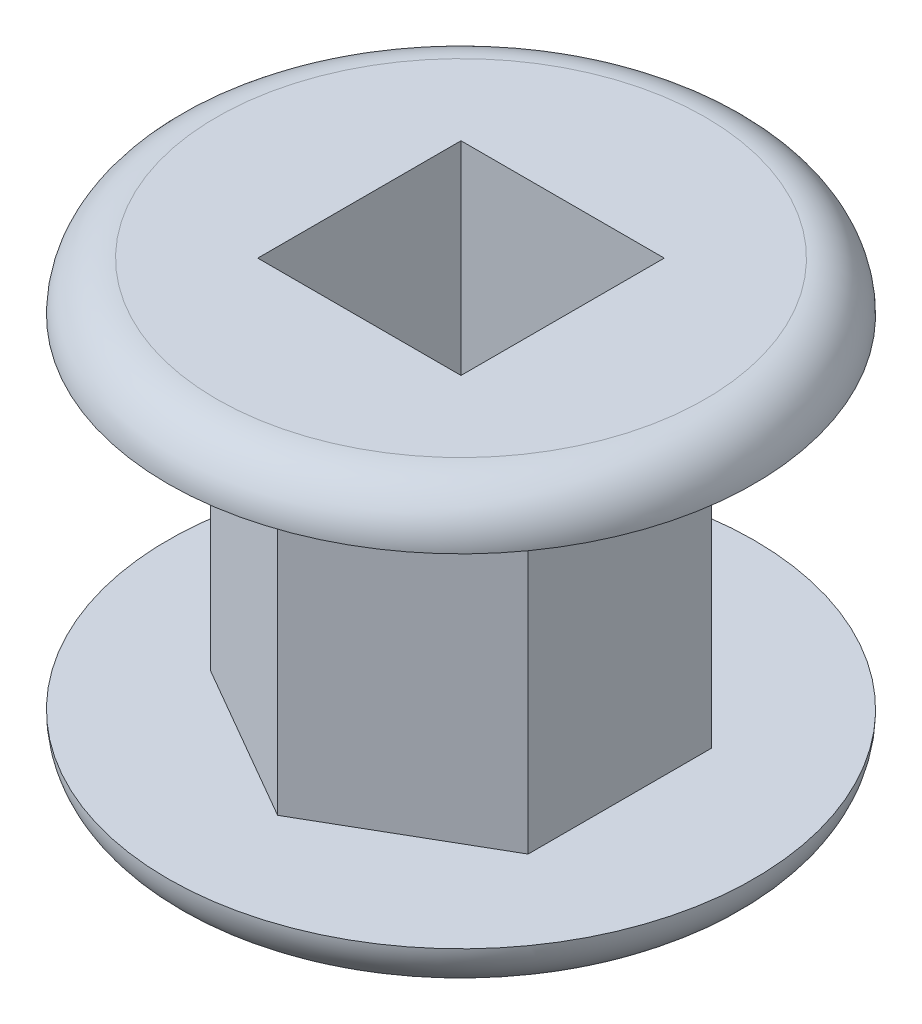
ISO-10303-21;
HEADER;
FILE_DESCRIPTION(('STEP AP214'),'2;1');
FILE_NAME('part.step','',(''),(''),'','','');
FILE_SCHEMA(('AUTOMOTIVE_DESIGN { 1 0 10303 214 1 1 1 1 }'));
ENDSEC;
DATA;
#1=APPLICATION_CONTEXT('core data for automotive mechanical design processes');
#2=APPLICATION_PROTOCOL_DEFINITION('international standard','automotive_design',2000,#1);
#3=PRODUCT_CONTEXT('',#1,'mechanical');
#4=PRODUCT('Part','Part','',(#3));
#5=PRODUCT_RELATED_PRODUCT_CATEGORY('part','',(#4));
#6=PRODUCT_DEFINITION_FORMATION('','',#4);
#7=PRODUCT_DEFINITION_CONTEXT('part definition',#1,'design');
#8=PRODUCT_DEFINITION('design','',#6,#7);
#9=PRODUCT_DEFINITION_SHAPE('','',#8);
#10=(LENGTH_UNIT() NAMED_UNIT(*) SI_UNIT(.MILLI.,.METRE.));
#11=(NAMED_UNIT(*) PLANE_ANGLE_UNIT() SI_UNIT($,.RADIAN.));
#12=(NAMED_UNIT(*) SI_UNIT($,.STERADIAN.) SOLID_ANGLE_UNIT());
#13=UNCERTAINTY_MEASURE_WITH_UNIT(LENGTH_MEASURE(1.E-05),#10,'distance_accuracy_value','');
#14=(GEOMETRIC_REPRESENTATION_CONTEXT(3) GLOBAL_UNCERTAINTY_ASSIGNED_CONTEXT((#13)) GLOBAL_UNIT_ASSIGNED_CONTEXT((#10,
#11,#12)) REPRESENTATION_CONTEXT('',''));
#15=CARTESIAN_POINT('',(0.,0.,0.));
#16=DIRECTION('',(0.,0.,1.));
#17=DIRECTION('',(1.,0.,0.));
#18=AXIS2_PLACEMENT_3D('',#15,#16,#17);
#19=CARTESIAN_POINT('',(5.159375,6.35,-2.97876654510023));
#20=DIRECTION('',(-0.5,0.,0.866025403784439));
#21=DIRECTION('',(0.866025403784439,0.,0.5));
#22=AXIS2_PLACEMENT_3D('',#19,#20,#21);
#23=PLANE('',#22);
#24=DIRECTION('',(0.866025403784439,0.,0.5));
#25=VECTOR('',#24,1.);
#26=CARTESIAN_POINT('',(5.159375,-5.55625,-2.97876654510023));
#27=LINE('',#26,#25);
#28=CARTESIAN_POINT('',(0.,-5.55625,-5.95753309020045));
#29=VERTEX_POINT('',#28);
#30=CARTESIAN_POINT('',(5.159375,-5.55625,-2.97876654510023));
#31=VERTEX_POINT('',#30);
#32=EDGE_CURVE('E166',#29,#31,#27,.T.);
#33=ORIENTED_EDGE('',*,*,#32,.F.);
#34=DIRECTION('',(0.,-1.,0.));
#35=VECTOR('',#34,1.);
#36=CARTESIAN_POINT('',(0.,6.35,-5.95753309020045));
#37=LINE('',#36,#35);
#38=CARTESIAN_POINT('',(0.,5.55625,-5.95753309020045));
#39=VERTEX_POINT('',#38);
#40=EDGE_CURVE('E201',#39,#29,#37,.T.);
#41=ORIENTED_EDGE('',*,*,#40,.F.);
#42=DIRECTION('',(-0.866025403784439,0.,-0.5));
#43=VECTOR('',#42,1.);
#44=CARTESIAN_POINT('',(5.159375,5.55625,-2.97876654510023));
#45=LINE('',#44,#43);
#46=CARTESIAN_POINT('',(5.159375,5.55625,-2.97876654510023));
#47=VERTEX_POINT('',#46);
#48=EDGE_CURVE('E184',#47,#39,#45,.T.);
#49=ORIENTED_EDGE('',*,*,#48,.F.);
#50=DIRECTION('',(0.,-1.,0.));
#51=VECTOR('',#50,1.);
#52=CARTESIAN_POINT('',(5.159375,6.35,-2.97876654510023));
#53=LINE('',#52,#51);
#54=EDGE_CURVE('E187',#47,#31,#53,.T.);
#55=ORIENTED_EDGE('',*,*,#54,.T.);
#56=EDGE_LOOP('',(#33,#41,#49,#55));
#57=FACE_BOUND('',#56,.T.);
#58=ADVANCED_FACE('F39',(#57),#23,.F.);
#59=CARTESIAN_POINT('',(0.,6.35,-5.95753309020045));
#60=DIRECTION('',(0.5,0.,0.866025403784439));
#61=DIRECTION('',(0.866025403784439,0.,-0.5));
#62=AXIS2_PLACEMENT_3D('',#59,#60,#61);
#63=PLANE('',#62);
#64=DIRECTION('',(0.866025403784439,0.,-0.5));
#65=VECTOR('',#64,1.);
#66=CARTESIAN_POINT('',(0.,-5.55625,-5.95753309020045));
#67=LINE('',#66,#65);
#68=CARTESIAN_POINT('',(-5.159375,-5.55625,-2.97876654510023));
#69=VERTEX_POINT('',#68);
#70=EDGE_CURVE('E163',#69,#29,#67,.T.);
#71=ORIENTED_EDGE('',*,*,#70,.F.);
#72=DIRECTION('',(0.,-1.,0.));
#73=VECTOR('',#72,1.);
#74=CARTESIAN_POINT('',(-5.159375,6.35,-2.97876654510023));
#75=LINE('',#74,#73);
#76=CARTESIAN_POINT('',(-5.159375,5.55625,-2.97876654510023));
#77=VERTEX_POINT('',#76);
#78=EDGE_CURVE('E198',#77,#69,#75,.T.);
#79=ORIENTED_EDGE('',*,*,#78,.F.);
#80=DIRECTION('',(-0.866025403784439,0.,0.5));
#81=VECTOR('',#80,1.);
#82=CARTESIAN_POINT('',(0.,5.55625,-5.95753309020045));
#83=LINE('',#82,#81);
#84=EDGE_CURVE('E181',#39,#77,#83,.T.);
#85=ORIENTED_EDGE('',*,*,#84,.F.);
#86=ORIENTED_EDGE('',*,*,#40,.T.);
#87=EDGE_LOOP('',(#71,#79,#85,#86));
#88=FACE_BOUND('',#87,.T.);
#89=ADVANCED_FACE('F225',(#88),#63,.F.);
#90=CARTESIAN_POINT('',(-5.159375,6.35,-2.97876654510023));
#91=DIRECTION('',(1.,0.,0.));
#92=DIRECTION('',(0.,0.,-1.));
#93=AXIS2_PLACEMENT_3D('',#90,#91,#92);
#94=PLANE('',#93);
#95=DIRECTION('',(0.,0.,-1.));
#96=VECTOR('',#95,1.);
#97=CARTESIAN_POINT('',(-5.159375,-5.55625,-2.97876654510023));
#98=LINE('',#97,#96);
#99=CARTESIAN_POINT('',(-5.159375,-5.55625,2.97876654510023));
#100=VERTEX_POINT('',#99);
#101=EDGE_CURVE('E160',#100,#69,#98,.T.);
#102=ORIENTED_EDGE('',*,*,#101,.F.);
#103=DIRECTION('',(0.,-1.,0.));
#104=VECTOR('',#103,1.);
#105=CARTESIAN_POINT('',(-5.159375,6.35,2.97876654510023));
#106=LINE('',#105,#104);
#107=CARTESIAN_POINT('',(-5.159375,5.55625,2.97876654510023));
#108=VERTEX_POINT('',#107);
#109=EDGE_CURVE('E195',#108,#100,#106,.T.);
#110=ORIENTED_EDGE('',*,*,#109,.F.);
#111=DIRECTION('',(0.,0.,1.));
#112=VECTOR('',#111,1.);
#113=CARTESIAN_POINT('',(-5.159375,5.55625,-2.97876654510023));
#114=LINE('',#113,#112);
#115=EDGE_CURVE('E178',#77,#108,#114,.T.);
#116=ORIENTED_EDGE('',*,*,#115,.F.);
#117=ORIENTED_EDGE('',*,*,#78,.T.);
#118=EDGE_LOOP('',(#102,#110,#116,#117));
#119=FACE_BOUND('',#118,.T.);
#120=ADVANCED_FACE('F228',(#119),#94,.F.);
#121=CARTESIAN_POINT('',(-5.159375,6.35,2.97876654510023));
#122=DIRECTION('',(0.5,0.,-0.866025403784439));
#123=DIRECTION('',(-0.866025403784439,0.,-0.5));
#124=AXIS2_PLACEMENT_3D('',#121,#122,#123);
#125=PLANE('',#124);
#126=DIRECTION('',(-0.866025403784439,0.,-0.5));
#127=VECTOR('',#126,1.);
#128=CARTESIAN_POINT('',(-5.159375,-5.55625,2.97876654510023));
#129=LINE('',#128,#127);
#130=CARTESIAN_POINT('',(0.,-5.55625,5.95753309020045));
#131=VERTEX_POINT('',#130);
#132=EDGE_CURVE('E157',#131,#100,#129,.T.);
#133=ORIENTED_EDGE('',*,*,#132,.F.);
#134=DIRECTION('',(0.,-1.,0.));
#135=VECTOR('',#134,1.);
#136=CARTESIAN_POINT('',(0.,6.35,5.95753309020045));
#137=LINE('',#136,#135);
#138=CARTESIAN_POINT('',(0.,5.55625,5.95753309020045));
#139=VERTEX_POINT('',#138);
#140=EDGE_CURVE('E192',#139,#131,#137,.T.);
#141=ORIENTED_EDGE('',*,*,#140,.F.);
#142=DIRECTION('',(0.866025403784439,0.,0.5));
#143=VECTOR('',#142,1.);
#144=CARTESIAN_POINT('',(-5.159375,5.55625,2.97876654510023));
#145=LINE('',#144,#143);
#146=EDGE_CURVE('E175',#108,#139,#145,.T.);
#147=ORIENTED_EDGE('',*,*,#146,.F.);
#148=ORIENTED_EDGE('',*,*,#109,.T.);
#149=EDGE_LOOP('',(#133,#141,#147,#148));
#150=FACE_BOUND('',#149,.T.);
#151=ADVANCED_FACE('F242',(#150),#125,.F.);
#152=CARTESIAN_POINT('',(0.,6.35,5.95753309020045));
#153=DIRECTION('',(-0.5,0.,-0.866025403784439));
#154=DIRECTION('',(-0.866025403784439,0.,0.5));
#155=AXIS2_PLACEMENT_3D('',#152,#153,#154);
#156=PLANE('',#155);
#157=DIRECTION('',(-0.866025403784439,0.,0.5));
#158=VECTOR('',#157,1.);
#159=CARTESIAN_POINT('',(0.,-5.55625,5.95753309020045));
#160=LINE('',#159,#158);
#161=CARTESIAN_POINT('',(5.159375,-5.55625,2.97876654510023));
#162=VERTEX_POINT('',#161);
#163=EDGE_CURVE('E154',#162,#131,#160,.T.);
#164=ORIENTED_EDGE('',*,*,#163,.F.);
#165=DIRECTION('',(0.,-1.,0.));
#166=VECTOR('',#165,1.);
#167=CARTESIAN_POINT('',(5.159375,6.35,2.97876654510023));
#168=LINE('',#167,#166);
#169=CARTESIAN_POINT('',(5.159375,5.55625,2.97876654510023));
#170=VERTEX_POINT('',#169);
#171=EDGE_CURVE('E190',#170,#162,#168,.T.);
#172=ORIENTED_EDGE('',*,*,#171,.F.);
#173=DIRECTION('',(0.866025403784439,0.,-0.5));
#174=VECTOR('',#173,1.);
#175=CARTESIAN_POINT('',(0.,5.55625,5.95753309020045));
#176=LINE('',#175,#174);
#177=EDGE_CURVE('E172',#139,#170,#176,.T.);
#178=ORIENTED_EDGE('',*,*,#177,.F.);
#179=ORIENTED_EDGE('',*,*,#140,.T.);
#180=EDGE_LOOP('',(#164,#172,#178,#179));
#181=FACE_BOUND('',#180,.T.);
#182=ADVANCED_FACE('F239',(#181),#156,.F.);
#183=CARTESIAN_POINT('',(5.159375,6.35,2.97876654510023));
#184=DIRECTION('',(-1.,0.,0.));
#185=DIRECTION('',(0.,0.,1.));
#186=AXIS2_PLACEMENT_3D('',#183,#184,#185);
#187=PLANE('',#186);
#188=DIRECTION('',(0.,0.,1.));
#189=VECTOR('',#188,1.);
#190=CARTESIAN_POINT('',(5.159375,-5.55625,2.97876654510023));
#191=LINE('',#190,#189);
#192=EDGE_CURVE('E207',#31,#162,#191,.T.);
#193=ORIENTED_EDGE('',*,*,#192,.F.);
#194=ORIENTED_EDGE('',*,*,#54,.F.);
#195=DIRECTION('',(0.,0.,-1.));
#196=VECTOR('',#195,1.);
#197=CARTESIAN_POINT('',(5.159375,5.55625,2.97876654510023));
#198=LINE('',#197,#196);
#199=EDGE_CURVE('E204',#170,#47,#198,.T.);
#200=ORIENTED_EDGE('',*,*,#199,.F.);
#201=ORIENTED_EDGE('',*,*,#171,.T.);
#202=EDGE_LOOP('',(#193,#194,#200,#201));
#203=FACE_BOUND('',#202,.T.);
#204=ADVANCED_FACE('F235',(#203),#187,.F.);
#205=CARTESIAN_POINT('',(0.,5.55625,0.));
#206=DIRECTION('',(0.,1.,0.));
#207=DIRECTION('',(0.,0.,1.));
#208=AXIS2_PLACEMENT_3D('',#205,#206,#207);
#209=PLANE('',#208);
#210=CARTESIAN_POINT('',(0.,5.55625,0.));
#211=DIRECTION('',(0.,1.,0.));
#212=DIRECTION('',(0.,0.,1.));
#213=AXIS2_PLACEMENT_3D('',#210,#211,#212);
#214=CIRCLE('',#213,9.525);
#215=CARTESIAN_POINT('',(0.,5.55625,9.525));
#216=VERTEX_POINT('',#215);
#217=EDGE_CURVE('E169',#216,#216,#214,.T.);
#218=ORIENTED_EDGE('',*,*,#217,.F.);
#219=EDGE_LOOP('',(#218));
#220=FACE_BOUND('',#219,.T.);
#221=ORIENTED_EDGE('',*,*,#199,.T.);
#222=ORIENTED_EDGE('',*,*,#48,.T.);
#223=ORIENTED_EDGE('',*,*,#84,.T.);
#224=ORIENTED_EDGE('',*,*,#115,.T.);
#225=ORIENTED_EDGE('',*,*,#146,.T.);
#226=ORIENTED_EDGE('',*,*,#177,.T.);
#227=EDGE_LOOP('',(#221,#222,#223,#224,#225,#226));
#228=FACE_BOUND('',#227,.T.);
#229=ADVANCED_FACE('F231',(#220,#228),#209,.F.);
#230=CARTESIAN_POINT('',(0.,7.14375,0.));
#231=DIRECTION('',(0.,1.,0.));
#232=DIRECTION('',(0.,0.,1.));
#233=AXIS2_PLACEMENT_3D('',#230,#231,#232);
#234=PLANE('',#233);
#235=CARTESIAN_POINT('',(0.,7.14375,0.));
#236=DIRECTION('',(0.,1.,0.));
#237=DIRECTION('',(0.,0.,1.));
#238=AXIS2_PLACEMENT_3D('',#235,#236,#237);
#239=CIRCLE('',#238,7.9375);
#240=CARTESIAN_POINT('',(0.,7.14375,7.9375));
#241=VERTEX_POINT('',#240);
#242=EDGE_CURVE('E11',#241,#241,#239,.T.);
#243=ORIENTED_EDGE('',*,*,#242,.T.);
#244=EDGE_LOOP('',(#243));
#245=FACE_BOUND('',#244,.T.);
#246=DIRECTION('',(0.,0.,-1.));
#247=VECTOR('',#246,1.);
#248=CARTESIAN_POINT('',(3.302,7.14375,3.302));
#249=LINE('',#248,#247);
#250=CARTESIAN_POINT('',(3.302,7.14375,3.302));
#251=VERTEX_POINT('',#250);
#252=CARTESIAN_POINT('',(3.302,7.14375,-3.302));
#253=VERTEX_POINT('',#252);
#254=EDGE_CURVE('E54',#251,#253,#249,.T.);
#255=ORIENTED_EDGE('',*,*,#254,.F.);
#256=DIRECTION('',(1.,0.,0.));
#257=VECTOR('',#256,1.);
#258=CARTESIAN_POINT('',(-3.302,7.14375,3.302));
#259=LINE('',#258,#257);
#260=CARTESIAN_POINT('',(-3.302,7.14375,3.302));
#261=VERTEX_POINT('',#260);
#262=EDGE_CURVE('E133',#261,#251,#259,.T.);
#263=ORIENTED_EDGE('',*,*,#262,.F.);
#264=DIRECTION('',(0.,0.,1.));
#265=VECTOR('',#264,1.);
#266=CARTESIAN_POINT('',(-3.302,7.14375,3.302));
#267=LINE('',#266,#265);
#268=CARTESIAN_POINT('',(-3.302,7.14375,-3.302));
#269=VERTEX_POINT('',#268);
#270=EDGE_CURVE('E136',#269,#261,#267,.T.);
#271=ORIENTED_EDGE('',*,*,#270,.F.);
#272=DIRECTION('',(-1.,0.,0.));
#273=VECTOR('',#272,1.);
#274=CARTESIAN_POINT('',(-3.302,7.14375,-3.302));
#275=LINE('',#274,#273);
#276=EDGE_CURVE('E142',#253,#269,#275,.T.);
#277=ORIENTED_EDGE('',*,*,#276,.F.);
#278=EDGE_LOOP('',(#255,#263,#271,#277));
#279=FACE_BOUND('',#278,.T.);
#280=ADVANCED_FACE('F221',(#245,#279),#234,.T.);
#281=CARTESIAN_POINT('',(0.,-5.55625,0.));
#282=DIRECTION('',(0.,-1.,0.));
#283=DIRECTION('',(0.,0.,1.));
#284=AXIS2_PLACEMENT_3D('',#281,#282,#283);
#285=PLANE('',#284);
#286=CARTESIAN_POINT('',(0.,-5.55625,0.));
#287=DIRECTION('',(0.,1.,0.));
#288=DIRECTION('',(0.,0.,1.));
#289=AXIS2_PLACEMENT_3D('',#286,#287,#288);
#290=CIRCLE('',#289,9.525);
#291=CARTESIAN_POINT('',(0.,-5.55625,9.525));
#292=VERTEX_POINT('',#291);
#293=EDGE_CURVE('E148',#292,#292,#290,.T.);
#294=ORIENTED_EDGE('',*,*,#293,.T.);
#295=EDGE_LOOP('',(#294));
#296=FACE_BOUND('',#295,.T.);
#297=ORIENTED_EDGE('',*,*,#70,.T.);
#298=ORIENTED_EDGE('',*,*,#32,.T.);
#299=ORIENTED_EDGE('',*,*,#192,.T.);
#300=ORIENTED_EDGE('',*,*,#163,.T.);
#301=ORIENTED_EDGE('',*,*,#132,.T.);
#302=ORIENTED_EDGE('',*,*,#101,.T.);
#303=EDGE_LOOP('',(#297,#298,#299,#300,#301,#302));
#304=FACE_BOUND('',#303,.T.);
#305=ADVANCED_FACE('F218',(#296,#304),#285,.F.);
#306=CARTESIAN_POINT('',(0.,-7.14375,0.));
#307=DIRECTION('',(0.,-1.,0.));
#308=DIRECTION('',(0.,0.,1.));
#309=AXIS2_PLACEMENT_3D('',#306,#307,#308);
#310=PLANE('',#309);
#311=CARTESIAN_POINT('',(0.,-7.14375,0.));
#312=DIRECTION('',(0.,-1.,0.));
#313=DIRECTION('',(0.,0.,-1.));
#314=AXIS2_PLACEMENT_3D('',#311,#312,#313);
#315=CIRCLE('',#314,7.9375);
#316=CARTESIAN_POINT('',(0.,-7.14375,-7.9375));
#317=VERTEX_POINT('',#316);
#318=EDGE_CURVE('E47',#317,#317,#315,.T.);
#319=ORIENTED_EDGE('',*,*,#318,.T.);
#320=EDGE_LOOP('',(#319));
#321=FACE_BOUND('',#320,.T.);
#322=DIRECTION('',(0.,0.,-1.));
#323=VECTOR('',#322,1.);
#324=CARTESIAN_POINT('',(3.302,-7.14375,3.302));
#325=LINE('',#324,#323);
#326=CARTESIAN_POINT('',(3.302,-7.14375,3.302));
#327=VERTEX_POINT('',#326);
#328=CARTESIAN_POINT('',(3.302,-7.14375,-3.302));
#329=VERTEX_POINT('',#328);
#330=EDGE_CURVE('E118',#327,#329,#325,.T.);
#331=ORIENTED_EDGE('',*,*,#330,.T.);
#332=DIRECTION('',(-1.,0.,0.));
#333=VECTOR('',#332,1.);
#334=CARTESIAN_POINT('',(-3.302,-7.14375,-3.302));
#335=LINE('',#334,#333);
#336=CARTESIAN_POINT('',(-3.302,-7.14375,-3.302));
#337=VERTEX_POINT('',#336);
#338=EDGE_CURVE('E127',#329,#337,#335,.T.);
#339=ORIENTED_EDGE('',*,*,#338,.T.);
#340=DIRECTION('',(0.,0.,1.));
#341=VECTOR('',#340,1.);
#342=CARTESIAN_POINT('',(-3.302,-7.14375,3.302));
#343=LINE('',#342,#341);
#344=CARTESIAN_POINT('',(-3.302,-7.14375,3.302));
#345=VERTEX_POINT('',#344);
#346=EDGE_CURVE('E62',#337,#345,#343,.T.);
#347=ORIENTED_EDGE('',*,*,#346,.T.);
#348=DIRECTION('',(1.,0.,0.));
#349=VECTOR('',#348,1.);
#350=CARTESIAN_POINT('',(-3.302,-7.14375,3.302));
#351=LINE('',#350,#349);
#352=EDGE_CURVE('E124',#345,#327,#351,.T.);
#353=ORIENTED_EDGE('',*,*,#352,.T.);
#354=EDGE_LOOP('',(#331,#339,#347,#353));
#355=FACE_BOUND('',#354,.T.);
#356=ADVANCED_FACE('F131',(#321,#355),#310,.T.);
#357=CARTESIAN_POINT('',(3.302,-7.14375,3.302));
#358=DIRECTION('',(1.,0.,0.));
#359=DIRECTION('',(0.,0.,-1.));
#360=AXIS2_PLACEMENT_3D('',#357,#358,#359);
#361=PLANE('',#360);
#362=ORIENTED_EDGE('',*,*,#254,.T.);
#363=DIRECTION('',(0.,1.,0.));
#364=VECTOR('',#363,1.);
#365=CARTESIAN_POINT('',(3.302,-7.14375,-3.302));
#366=LINE('',#365,#364);
#367=EDGE_CURVE('E114',#329,#253,#366,.T.);
#368=ORIENTED_EDGE('',*,*,#367,.F.);
#369=ORIENTED_EDGE('',*,*,#330,.F.);
#370=DIRECTION('',(0.,1.,0.));
#371=VECTOR('',#370,1.);
#372=CARTESIAN_POINT('',(3.302,-7.14375,3.302));
#373=LINE('',#372,#371);
#374=EDGE_CURVE('E146',#327,#251,#373,.T.);
#375=ORIENTED_EDGE('',*,*,#374,.T.);
#376=EDGE_LOOP('',(#362,#368,#369,#375));
#377=FACE_BOUND('',#376,.T.);
#378=ADVANCED_FACE('F116',(#377),#361,.F.);
#379=CARTESIAN_POINT('',(-3.302,-7.14375,3.302));
#380=DIRECTION('',(0.,0.,1.));
#381=DIRECTION('',(1.,0.,0.));
#382=AXIS2_PLACEMENT_3D('',#379,#380,#381);
#383=PLANE('',#382);
#384=ORIENTED_EDGE('',*,*,#262,.T.);
#385=ORIENTED_EDGE('',*,*,#374,.F.);
#386=ORIENTED_EDGE('',*,*,#352,.F.);
#387=DIRECTION('',(0.,1.,0.));
#388=VECTOR('',#387,1.);
#389=CARTESIAN_POINT('',(-3.302,-7.14375,3.302));
#390=LINE('',#389,#388);
#391=EDGE_CURVE('E149',#345,#261,#390,.T.);
#392=ORIENTED_EDGE('',*,*,#391,.T.);
#393=EDGE_LOOP('',(#384,#385,#386,#392));
#394=FACE_BOUND('',#393,.T.);
#395=ADVANCED_FACE('F311',(#394),#383,.F.);
#396=CARTESIAN_POINT('',(-3.302,-7.14375,3.302));
#397=DIRECTION('',(-1.,0.,0.));
#398=DIRECTION('',(0.,0.,1.));
#399=AXIS2_PLACEMENT_3D('',#396,#397,#398);
#400=PLANE('',#399);
#401=ORIENTED_EDGE('',*,*,#270,.T.);
#402=ORIENTED_EDGE('',*,*,#391,.F.);
#403=ORIENTED_EDGE('',*,*,#346,.F.);
#404=DIRECTION('',(0.,1.,0.));
#405=VECTOR('',#404,1.);
#406=CARTESIAN_POINT('',(-3.302,-7.14375,-3.302));
#407=LINE('',#406,#405);
#408=EDGE_CURVE('E123',#337,#269,#407,.T.);
#409=ORIENTED_EDGE('',*,*,#408,.T.);
#410=EDGE_LOOP('',(#401,#402,#403,#409));
#411=FACE_BOUND('',#410,.T.);
#412=ADVANCED_FACE('F313',(#411),#400,.F.);
#413=CARTESIAN_POINT('',(-3.302,-7.14375,-3.302));
#414=DIRECTION('',(0.,0.,-1.));
#415=DIRECTION('',(-1.,0.,0.));
#416=AXIS2_PLACEMENT_3D('',#413,#414,#415);
#417=PLANE('',#416);
#418=ORIENTED_EDGE('',*,*,#276,.T.);
#419=ORIENTED_EDGE('',*,*,#408,.F.);
#420=ORIENTED_EDGE('',*,*,#338,.F.);
#421=ORIENTED_EDGE('',*,*,#367,.T.);
#422=EDGE_LOOP('',(#418,#419,#420,#421));
#423=FACE_BOUND('',#422,.T.);
#424=ADVANCED_FACE('F128',(#423),#417,.F.);
#425=CARTESIAN_POINT('',(0.,-5.55625,0.));
#426=DIRECTION('',(0.,-1.,0.));
#427=DIRECTION('',(0.,0.,-1.));
#428=AXIS2_PLACEMENT_3D('',#425,#426,#427);
#429=TOROIDAL_SURFACE('',#428,7.9375,1.5875);
#430=ORIENTED_EDGE('',*,*,#318,.F.);
#431=EDGE_LOOP('',(#430));
#432=FACE_BOUND('',#431,.T.);
#433=ORIENTED_EDGE('',*,*,#293,.F.);
#434=EDGE_LOOP('',(#433));
#435=FACE_BOUND('',#434,.T.);
#436=ADVANCED_FACE('F213',(#432,#435),#429,.T.);
#437=CARTESIAN_POINT('',(0.,5.55625,0.));
#438=DIRECTION('',(0.,1.,0.));
#439=DIRECTION('',(0.,0.,1.));
#440=AXIS2_PLACEMENT_3D('',#437,#438,#439);
#441=TOROIDAL_SURFACE('',#440,7.9375,1.5875);
#442=ORIENTED_EDGE('',*,*,#217,.T.);
#443=EDGE_LOOP('',(#442));
#444=FACE_BOUND('',#443,.T.);
#445=ORIENTED_EDGE('',*,*,#242,.F.);
#446=EDGE_LOOP('',(#445));
#447=FACE_BOUND('',#446,.T.);
#448=ADVANCED_FACE('F41',(#444,#447),#441,.T.);
#449=CLOSED_SHELL('',(#58,#89,#120,#151,#182,#204,#229,#280,#305,#356,#378,#395,#412,#424,#436,#448));
#450=MANIFOLD_SOLID_BREP('B2',#449);
#451=ADVANCED_BREP_SHAPE_REPRESENTATION('',(#18,#450),#14);
#452=SHAPE_DEFINITION_REPRESENTATION(#9,#451);
ENDSEC;
END-ISO-10303-21;
